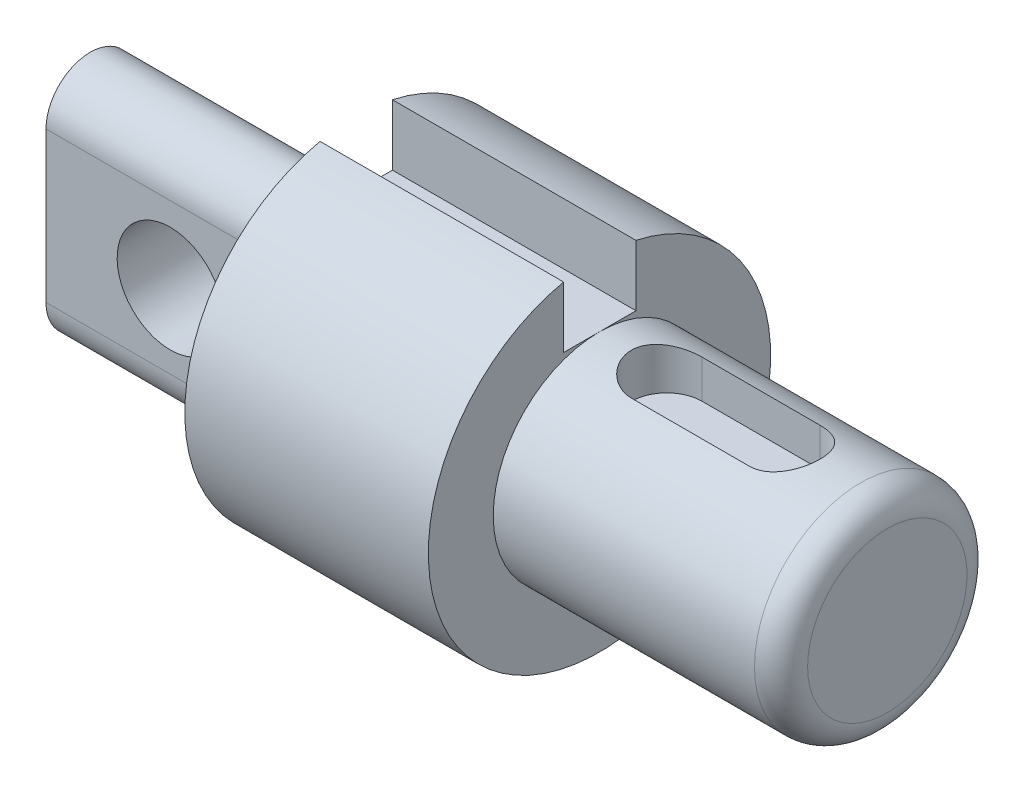
ISO-10303-21;
HEADER;
FILE_DESCRIPTION(('STEP AP214'),'2;1');
FILE_NAME('part.step','',(''),(''),'','','');
FILE_SCHEMA(('AUTOMOTIVE_DESIGN { 1 0 10303 214 1 1 1 1 }'));
ENDSEC;
DATA;
#1=APPLICATION_CONTEXT('core data for automotive mechanical design processes');
#2=APPLICATION_PROTOCOL_DEFINITION('international standard','automotive_design',2000,#1);
#3=PRODUCT_CONTEXT('',#1,'mechanical');
#4=PRODUCT('Part','Part','',(#3));
#5=PRODUCT_RELATED_PRODUCT_CATEGORY('part','',(#4));
#6=PRODUCT_DEFINITION_FORMATION('','',#4);
#7=PRODUCT_DEFINITION_CONTEXT('part definition',#1,'design');
#8=PRODUCT_DEFINITION('design','',#6,#7);
#9=PRODUCT_DEFINITION_SHAPE('','',#8);
#10=(LENGTH_UNIT() NAMED_UNIT(*) SI_UNIT(.MILLI.,.METRE.));
#11=(NAMED_UNIT(*) PLANE_ANGLE_UNIT() SI_UNIT($,.RADIAN.));
#12=(NAMED_UNIT(*) SI_UNIT($,.STERADIAN.) SOLID_ANGLE_UNIT());
#13=UNCERTAINTY_MEASURE_WITH_UNIT(LENGTH_MEASURE(1.E-05),#10,'distance_accuracy_value','');
#14=(GEOMETRIC_REPRESENTATION_CONTEXT(3) GLOBAL_UNCERTAINTY_ASSIGNED_CONTEXT((#13)) GLOBAL_UNIT_ASSIGNED_CONTEXT((#10,
#11,#12)) REPRESENTATION_CONTEXT('',''));
#15=CARTESIAN_POINT('',(0.,0.,0.));
#16=DIRECTION('',(0.,0.,1.));
#17=DIRECTION('',(1.,0.,0.));
#18=AXIS2_PLACEMENT_3D('',#15,#16,#17);
#19=CARTESIAN_POINT('',(0.,0.,0.));
#20=DIRECTION('',(1.,0.,0.));
#21=DIRECTION('',(0.,0.,-1.));
#22=AXIS2_PLACEMENT_3D('',#19,#20,#21);
#23=PLANE('',#22);
#24=DIRECTION('',(0.,-1.,0.));
#25=VECTOR('',#24,1.);
#26=CARTESIAN_POINT('',(0.,20.,-8.23672396529988));
#27=LINE('',#26,#25);
#28=CARTESIAN_POINT('',(0.,13.7691595830885,-8.23672396529988));
#29=VERTEX_POINT('',#28);
#30=CARTESIAN_POINT('',(0.,0.,-8.23672396529988));
#31=VERTEX_POINT('',#30);
#32=EDGE_CURVE('E195',#29,#31,#27,.T.);
#33=ORIENTED_EDGE('',*,*,#32,.F.);
#34=CARTESIAN_POINT('',(0.,-24.,0.));
#35=DIRECTION('',(-1.,0.,0.));
#36=DIRECTION('',(0.,0.,1.));
#37=AXIS2_PLACEMENT_3D('',#34,#35,#36);
#38=CIRCLE('',#37,38.6568627450981);
#39=CARTESIAN_POINT('',(0.,13.797214147911,8.10701177686995));
#40=VERTEX_POINT('',#39);
#41=EDGE_CURVE('E248',#29,#40,#38,.T.);
#42=ORIENTED_EDGE('',*,*,#41,.T.);
#43=DIRECTION('',(0.,-1.,0.));
#44=VECTOR('',#43,1.);
#45=CARTESIAN_POINT('',(0.,20.,8.10701177686995));
#46=LINE('',#45,#44);
#47=CARTESIAN_POINT('',(0.,0.,8.10701177686995));
#48=VERTEX_POINT('',#47);
#49=EDGE_CURVE('E191',#40,#48,#46,.T.);
#50=ORIENTED_EDGE('',*,*,#49,.T.);
#51=DIRECTION('',(0.,0.,1.));
#52=VECTOR('',#51,1.);
#53=CARTESIAN_POINT('',(0.,0.,-8.23672396529988));
#54=LINE('',#53,#52);
#55=EDGE_CURVE('E181',#31,#48,#54,.T.);
#56=ORIENTED_EDGE('',*,*,#55,.F.);
#57=EDGE_LOOP('',(#33,#42,#50,#56));
#58=FACE_BOUND('',#57,.T.);
#59=CARTESIAN_POINT('',(0.,-12.8221056297422,0.));
#60=DIRECTION('',(-1.,0.,0.));
#61=DIRECTION('',(0.,0.,1.));
#62=AXIS2_PLACEMENT_3D('',#59,#60,#61);
#63=CIRCLE('',#62,10.);
#64=CARTESIAN_POINT('',(0.,-12.8221056297422,10.));
#65=VERTEX_POINT('',#64);
#66=CARTESIAN_POINT('',(0.,-12.8221056297422,-10.));
#67=VERTEX_POINT('',#66);
#68=EDGE_CURVE('E157',#65,#67,#63,.T.);
#69=ORIENTED_EDGE('',*,*,#68,.F.);
#70=DIRECTION('',(0.,1.,0.));
#71=VECTOR('',#70,1.);
#72=CARTESIAN_POINT('',(0.,-12.8221056297422,10.));
#73=LINE('',#72,#71);
#74=CARTESIAN_POINT('',(0.,-46.7570533745629,10.));
#75=VERTEX_POINT('',#74);
#76=EDGE_CURVE('E154',#75,#65,#73,.T.);
#77=ORIENTED_EDGE('',*,*,#76,.F.);
#78=CARTESIAN_POINT('',(0.,-46.7570533745629,0.));
#79=DIRECTION('',(-1.,0.,0.));
#80=DIRECTION('',(0.,0.,1.));
#81=AXIS2_PLACEMENT_3D('',#78,#79,#80);
#82=CIRCLE('',#81,10.);
#83=CARTESIAN_POINT('',(0.,-46.7570533745629,-10.));
#84=VERTEX_POINT('',#83);
#85=EDGE_CURVE('E63',#84,#75,#82,.T.);
#86=ORIENTED_EDGE('',*,*,#85,.F.);
#87=DIRECTION('',(0.,-1.,0.));
#88=VECTOR('',#87,1.);
#89=CARTESIAN_POINT('',(0.,-12.8221056297422,-10.));
#90=LINE('',#89,#88);
#91=EDGE_CURVE('E58',#67,#84,#90,.T.);
#92=ORIENTED_EDGE('',*,*,#91,.F.);
#93=EDGE_LOOP('',(#69,#77,#86,#92));
#94=FACE_BOUND('',#93,.T.);
#95=ADVANCED_FACE('F41',(#58,#94),#23,.F.);
#96=CARTESIAN_POINT('',(-5.28155019301109,-24.,0.));
#97=DIRECTION('',(-1.,0.,0.));
#98=DIRECTION('',(0.,0.,1.));
#99=AXIS2_PLACEMENT_3D('',#96,#97,#98);
#100=CYLINDRICAL_SURFACE('',#99,38.6568627450981);
#101=DIRECTION('',(-1.,0.,0.));
#102=VECTOR('',#101,1.);
#103=CARTESIAN_POINT('',(-5.28155019301109,13.7691595830885,-8.23672396529988));
#104=LINE('',#103,#102);
#105=CARTESIAN_POINT('',(55.,13.7691595830885,-8.23672396529988));
#106=VERTEX_POINT('',#105);
#107=EDGE_CURVE('E205',#106,#29,#104,.T.);
#108=ORIENTED_EDGE('',*,*,#107,.F.);
#109=CARTESIAN_POINT('',(55.,-24.,0.));
#110=DIRECTION('',(-1.,0.,0.));
#111=DIRECTION('',(0.,0.,1.));
#112=AXIS2_PLACEMENT_3D('',#109,#110,#111);
#113=CIRCLE('',#112,38.6568627450981);
#114=CARTESIAN_POINT('',(55.,13.797214147911,8.10701177686995));
#115=VERTEX_POINT('',#114);
#116=EDGE_CURVE('E244',#106,#115,#113,.T.);
#117=ORIENTED_EDGE('',*,*,#116,.T.);
#118=DIRECTION('',(-1.,0.,0.));
#119=VECTOR('',#118,1.);
#120=CARTESIAN_POINT('',(-5.28155019301109,13.797214147911,8.10701177686995));
#121=LINE('',#120,#119);
#122=EDGE_CURVE('E202',#40,#115,#121,.F.);
#123=ORIENTED_EDGE('',*,*,#122,.F.);
#124=ORIENTED_EDGE('',*,*,#41,.F.);
#125=EDGE_LOOP('',(#108,#117,#123,#124));
#126=FACE_BOUND('',#125,.T.);
#127=ADVANCED_FACE('F308',(#126),#100,.T.);
#128=CARTESIAN_POINT('',(55.,14.656862745098,0.));
#129=DIRECTION('',(-1.,0.,0.));
#130=DIRECTION('',(0.,0.,1.));
#131=AXIS2_PLACEMENT_3D('',#128,#129,#130);
#132=PLANE('',#131);
#133=DIRECTION('',(0.,-1.,0.));
#134=VECTOR('',#133,1.);
#135=CARTESIAN_POINT('',(55.,20.,-8.23672396529988));
#136=LINE('',#135,#134);
#137=CARTESIAN_POINT('',(55.,0.,-8.23672396529988));
#138=VERTEX_POINT('',#137);
#139=EDGE_CURVE('E198',#106,#138,#136,.T.);
#140=ORIENTED_EDGE('',*,*,#139,.T.);
#141=DIRECTION('',(0.,0.,-1.));
#142=VECTOR('',#141,1.);
#143=CARTESIAN_POINT('',(55.,0.,-8.23672396529988));
#144=LINE('',#143,#142);
#145=CARTESIAN_POINT('',(55.,0.,0.));
#146=VERTEX_POINT('',#145);
#147=EDGE_CURVE('E172',#146,#138,#144,.T.);
#148=ORIENTED_EDGE('',*,*,#147,.F.);
#149=CARTESIAN_POINT('',(55.,-24.,0.));
#150=DIRECTION('',(-1.,0.,0.));
#151=DIRECTION('',(0.,0.,1.));
#152=AXIS2_PLACEMENT_3D('',#149,#150,#151);
#153=CIRCLE('',#152,24.);
#154=EDGE_CURVE('E229',#146,#146,#153,.T.);
#155=ORIENTED_EDGE('',*,*,#154,.T.);
#156=CARTESIAN_POINT('',(55.,0.,8.10701177686995));
#157=VERTEX_POINT('',#156);
#158=EDGE_CURVE('E174',#157,#146,#144,.T.);
#159=ORIENTED_EDGE('',*,*,#158,.F.);
#160=DIRECTION('',(0.,-1.,0.));
#161=VECTOR('',#160,1.);
#162=CARTESIAN_POINT('',(55.,20.,8.10701177686995));
#163=LINE('',#162,#161);
#164=EDGE_CURVE('E188',#115,#157,#163,.T.);
#165=ORIENTED_EDGE('',*,*,#164,.F.);
#166=ORIENTED_EDGE('',*,*,#116,.F.);
#167=EDGE_LOOP('',(#140,#148,#155,#159,#165,#166));
#168=FACE_BOUND('',#167,.T.);
#169=ADVANCED_FACE('F305',(#168),#132,.F.);
#170=CARTESIAN_POINT('',(-5.28155019301109,-24.,0.));
#171=DIRECTION('',(-1.,0.,0.));
#172=DIRECTION('',(0.,0.,1.));
#173=AXIS2_PLACEMENT_3D('',#170,#171,#172);
#174=CYLINDRICAL_SURFACE('',#173,24.);
#175=DIRECTION('',(-1.,0.,0.));
#176=VECTOR('',#175,1.);
#177=CARTESIAN_POINT('',(-5.28155019301109,-1.37258300203048,-8.));
#178=LINE('',#177,#176);
#179=CARTESIAN_POINT('',(70.1953780105919,-1.37258300203048,-8.));
#180=VERTEX_POINT('',#179);
#181=CARTESIAN_POINT('',(96.8123190764119,-1.37258300203048,-8.));
#182=VERTEX_POINT('',#181);
#183=EDGE_CURVE('E12',#180,#182,#178,.F.);
#184=ORIENTED_EDGE('',*,*,#183,.T.);
#185=CARTESIAN_POINT('',(96.8123190764119,-1.37258300203048,-8.));
#186=CARTESIAN_POINT('',(97.0305777607212,-1.37261881578731,-8.00003103397253));
#187=CARTESIAN_POINT('',(97.2488229333098,-1.36942629619781,-7.99106952215391));
#188=CARTESIAN_POINT('',(97.6836203807388,-1.35684672996035,-7.95539233420544));
#189=CARTESIAN_POINT('',(97.9001730966033,-1.3474613554851,-7.92868145068424));
#190=CARTESIAN_POINT('',(98.3294046882104,-1.32279442706748,-7.85784095608015));
#191=CARTESIAN_POINT('',(98.5420931140998,-1.30753036427985,-7.81376300920578));
#192=CARTESIAN_POINT('',(98.9627593468509,-1.27159268339852,-7.70860591189356));
#193=CARTESIAN_POINT('',(99.1707369831725,-1.25091886979989,-7.64752614701583));
#194=CARTESIAN_POINT('',(99.5804104924183,-1.20480489446374,-7.50895438725382));
#195=CARTESIAN_POINT('',(99.7821112878351,-1.17936858339518,-7.43147564503965));
#196=CARTESIAN_POINT('',(100.178200586441,-1.12445256650077,-7.26067322784619));
#197=CARTESIAN_POINT('',(100.372586337229,-1.09497135772433,-7.16734366014251));
#198=CARTESIAN_POINT('',(100.752836419907,-1.03279554124284,-6.96553397756357));
#199=CARTESIAN_POINT('',(100.938698978516,-1.00010026924828,-6.85705072873411));
#200=CARTESIAN_POINT('',(101.300852342869,-0.932376149650128,-6.6256519345341));
#201=CARTESIAN_POINT('',(101.477139673777,-0.897346465026512,-6.5027312003253));
#202=CARTESIAN_POINT('',(101.825095438673,-0.824625831930112,-6.23870411433486));
#203=CARTESIAN_POINT('',(101.99638376719,-0.786884620647681,-6.09711044069147));
#204=CARTESIAN_POINT('',(102.326539537596,-0.710929353356675,-5.80022937993206));
#205=CARTESIAN_POINT('',(102.485406738256,-0.672715288181531,-5.64494172699103));
#206=CARTESIAN_POINT('',(102.789797887577,-0.596826772139631,-5.32156641685159));
#207=CARTESIAN_POINT('',(102.935317132398,-0.559152515418647,-5.1534742852408));
#208=CARTESIAN_POINT('',(103.211964572097,-0.48537281416024,-4.80561194209852));
#209=CARTESIAN_POINT('',(103.343097764728,-0.44926682745154,-4.62584582091428));
#210=CARTESIAN_POINT('',(103.593417852379,-0.378643210011232,-4.25074998322404));
#211=CARTESIAN_POINT('',(103.712195054716,-0.344193216601044,-4.05513374464128));
#212=CARTESIAN_POINT('',(103.932733905434,-0.278928938556047,-3.65404556877216));
#213=CARTESIAN_POINT('',(104.0345018412,-0.248113311742212,-3.4485773095362));
#214=CARTESIAN_POINT('',(104.220214522842,-0.190986901233554,-3.02913922771072));
#215=CARTESIAN_POINT('',(104.304160127472,-0.164675900499144,-2.81516981533178));
#216=CARTESIAN_POINT('',(104.45346659983,-0.117325994006524,-2.38027596007901));
#217=CARTESIAN_POINT('',(104.518828264755,-0.096286862105315,-2.15935181599432));
#218=CARTESIAN_POINT('',(104.628394005751,-0.0607344027219715,-1.72000977307215));
#219=CARTESIAN_POINT('',(104.673254747699,-0.0460195974635165,-1.50177184659341));
#220=CARTESIAN_POINT('',(104.744642817813,-0.0224976080606529,-1.06200605406946));
#221=CARTESIAN_POINT('',(104.771170877872,-0.0136901880768622,-0.840478319723552));
#222=CARTESIAN_POINT('',(104.805628733257,-0.00223479533666958,-0.3958650024246));
#223=CARTESIAN_POINT('',(104.813562113642,0.000414364733208943,-0.172779728085906));
#224=CARTESIAN_POINT('',(104.810760540356,-0.000519530086272467,0.273257900019459));
#225=CARTESIAN_POINT('',(104.800026018792,-0.00410244072124655,0.496210256743293));
#226=CARTESIAN_POINT('',(104.760789872563,-0.0171339250305854,0.931485791446531));
#227=CARTESIAN_POINT('',(104.733006032904,-0.0263454671676339,1.14388124688078));
#228=CARTESIAN_POINT('',(104.660558975644,-0.0501837259138915,1.56553673919601));
#229=CARTESIAN_POINT('',(104.6158901541,-0.0648122403247453,1.77479571111391));
#230=CARTESIAN_POINT('',(104.510084870628,-0.0990984041516084,2.18860626056278));
#231=CARTESIAN_POINT('',(104.448953921881,-0.118754369759201,2.39315938923603));
#232=CARTESIAN_POINT('',(104.310702974943,-0.162603650576833,2.79636926246664));
#233=CARTESIAN_POINT('',(104.233576942924,-0.186798677728642,2.99502374945562));
#234=CARTESIAN_POINT('',(104.062871111967,-0.23944800385913,3.3876090612048));
#235=CARTESIAN_POINT('',(103.969093806652,-0.267952740377088,3.5814471906438));
#236=CARTESIAN_POINT('',(103.766442659186,-0.328276827276427,3.96060483828415));
#237=CARTESIAN_POINT('',(103.657563650696,-0.360097311054234,4.14592141222385));
#238=CARTESIAN_POINT('',(103.425483901893,-0.426252294036487,4.5068941081118));
#239=CARTESIAN_POINT('',(103.302282445429,-0.460586918921128,4.68254974634683));
#240=CARTESIAN_POINT('',(103.042355842802,-0.530920194718845,5.0232009487584));
#241=CARTESIAN_POINT('',(102.905630204912,-0.566918906111174,5.18819612496974));
#242=CARTESIAN_POINT('',(102.612724370301,-0.641410381347949,5.51412191940469));
#243=CARTESIAN_POINT('',(102.455930462506,-0.679940656982167,5.67449293138835));
#244=CARTESIAN_POINT('',(102.129464753586,-0.756788459235006,5.98148427361757));
#245=CARTESIAN_POINT('',(101.959797001792,-0.79510604871563,6.12810889546834));
#246=CARTESIAN_POINT('',(101.608456113104,-0.870506305498516,6.40682315490534));
#247=CARTESIAN_POINT('',(101.426774713121,-0.907588095879266,6.53890261822665));
#248=CARTESIAN_POINT('',(101.052699268743,-0.979418967728075,6.78745781697397));
#249=CARTESIAN_POINT('',(100.860309443295,-1.01416895615286,6.9039396368759));
#250=CARTESIAN_POINT('',(100.462944395078,-1.08083485549966,7.12215490772791));
#251=CARTESIAN_POINT('',(100.257821996823,-1.11269947050743,7.22363638171334));
#252=CARTESIAN_POINT('',(99.8391754109003,-1.17197012142812,7.40881268488483));
#253=CARTESIAN_POINT('',(99.6256547643362,-1.19937801200437,7.49251491735661));
#254=CARTESIAN_POINT('',(99.1918885725287,-1.24882439275111,7.64134565492558));
#255=CARTESIAN_POINT('',(98.9716506350404,-1.27086872067477,7.70649436714361));
#256=CARTESIAN_POINT('',(98.5259817831327,-1.30887055136156,7.81767760530816));
#257=CARTESIAN_POINT('',(98.3005532897417,-1.3248308332707,7.86372085933584));
#258=CARTESIAN_POINT('',(97.8650344316322,-1.3490612888241,7.9332390638637));
#259=CARTESIAN_POINT('',(97.6552201613353,-1.3578589175953,7.95826740531895));
#260=CARTESIAN_POINT('',(97.234382287092,-1.36963137121228,7.99164999637447));
#261=CARTESIAN_POINT('',(97.0233605973959,-1.3726137095866,8.0000257618744));
#262=CARTESIAN_POINT('',(96.8123190764119,-1.37258300203048,8.));
#263=B_SPLINE_CURVE_WITH_KNOTS('',3,(#185,#186,#187,#188,#189,#190,#191,#192,#193,#194,#195,
#196,#197,#198,#199,#200,#201,#202,#203,#204,#205,#206,#207,#208,#209,#210,#211,#212,#213,#214,
#215,#216,#217,#218,#219,#220,#221,#222,#223,#224,#225,#226,#227,#228,#229,#230,#231,#232,#233,
#234,#235,#236,#237,#238,#239,#240,#241,#242,#243,#244,#245,#246,#247,#248,#249,#250,#251,#252,
#253,#254,#255,#256,#257,#258,#259,#260,#261,#262),.UNSPECIFIED.,.F.,.F.,(4,2,2,2,2,2,2,2,2,2,2,
2,2,2,2,2,2,2,2,2,2,2,2,2,2,2,2,2,2,2,2,2,2,2,2,2,2,2,4),(0.,0.654547877903713,1.30891908939586,
1.96135817421321,2.61382084101742,3.26575822622461,3.91793850921429,4.57025387077327,
5.22280439628558,5.89828993537733,6.57378858975784,7.24952438368529,7.92502467674353,
8.61846244485442,9.31164331772814,10.0047907827111,10.6979085092282,11.3669250433694,
12.0359148669049,12.7047756983962,13.3736210479026,14.0160744611638,14.6587412852438,
15.3011931467132,15.9438878027294,16.5947882912859,17.2459120065947,17.8970682933825,
18.5482482643089,19.2301697730881,19.9118776729194,20.594059435017,21.2759743051343,
21.9682874467887,22.6603117412837,23.351579426262,24.0425309659451,24.6762531936181,
25.3091560893225),.UNSPECIFIED.);
#264=CARTESIAN_POINT('',(96.8123190764119,-1.37258300203048,8.));
#265=VERTEX_POINT('',#264);
#266=EDGE_CURVE('E260',#182,#265,#263,.T.);
#267=ORIENTED_EDGE('',*,*,#266,.T.);
#268=DIRECTION('',(-1.,0.,0.));
#269=VECTOR('',#268,1.);
#270=CARTESIAN_POINT('',(-5.28155019301109,-1.37258300203048,8.));
#271=LINE('',#270,#269);
#272=CARTESIAN_POINT('',(70.1953780105919,-1.37258300203048,8.));
#273=VERTEX_POINT('',#272);
#274=EDGE_CURVE('E51',#265,#273,#271,.T.);
#275=ORIENTED_EDGE('',*,*,#274,.T.);
#276=CARTESIAN_POINT('',(70.1953780105919,-1.37258300203048,8.));
#277=CARTESIAN_POINT('',(69.9771193262825,-1.37261881578731,8.00003103397253));
#278=CARTESIAN_POINT('',(69.7588741536939,-1.36942629619781,7.99106952215391));
#279=CARTESIAN_POINT('',(69.3240767062649,-1.35684672996035,7.95539233420544));
#280=CARTESIAN_POINT('',(69.1075239904004,-1.3474613554851,7.92868145068424));
#281=CARTESIAN_POINT('',(68.6782923987933,-1.32279442706748,7.85784095608015));
#282=CARTESIAN_POINT('',(68.465603972904,-1.30753036427986,7.81376300920578));
#283=CARTESIAN_POINT('',(68.0449377401528,-1.27159268339852,7.70860591189356));
#284=CARTESIAN_POINT('',(67.8369601038312,-1.25091886979989,7.64752614701583));
#285=CARTESIAN_POINT('',(67.4272865945855,-1.20480489446374,7.50895438725382));
#286=CARTESIAN_POINT('',(67.2255857991686,-1.17936858339518,7.43147564503965));
#287=CARTESIAN_POINT('',(66.8294965005629,-1.12445256650077,7.26067322784619));
#288=CARTESIAN_POINT('',(66.6351107497752,-1.09497135772433,7.16734366014251));
#289=CARTESIAN_POINT('',(66.2548606670967,-1.03279554124284,6.96553397756357));
#290=CARTESIAN_POINT('',(66.0689981084877,-1.00010026924828,6.85705072873411));
#291=CARTESIAN_POINT('',(65.7068447441351,-0.932376149650128,6.6256519345341));
#292=CARTESIAN_POINT('',(65.5305574132266,-0.897346465026512,6.5027312003253));
#293=CARTESIAN_POINT('',(65.1826016483304,-0.824625831930111,6.23870411433485));
#294=CARTESIAN_POINT('',(65.0113133198137,-0.786884620647679,6.09711044069146));
#295=CARTESIAN_POINT('',(64.6811575494077,-0.710929353356673,5.80022937993206));
#296=CARTESIAN_POINT('',(64.5222903487481,-0.672715288181531,5.64494172699104));
#297=CARTESIAN_POINT('',(64.2178991994263,-0.596826772139634,5.3215664168516));
#298=CARTESIAN_POINT('',(64.0723799546054,-0.559152515418653,5.1534742852408));
#299=CARTESIAN_POINT('',(63.7957325149071,-0.485372814160245,4.80561194209852));
#300=CARTESIAN_POINT('',(63.6645993222758,-0.449266827451542,4.62584582091428));
#301=CARTESIAN_POINT('',(63.4142792346243,-0.378643210011231,4.25074998322404));
#302=CARTESIAN_POINT('',(63.2955020322875,-0.344193216601042,4.05513374464128));
#303=CARTESIAN_POINT('',(63.0749631815702,-0.278928938556046,3.65404556877216));
#304=CARTESIAN_POINT('',(62.9731952458042,-0.248113311742214,3.4485773095362));
#305=CARTESIAN_POINT('',(62.7874825641616,-0.190986901233557,3.02913922771072));
#306=CARTESIAN_POINT('',(62.7035369595318,-0.164675900499145,2.81516981533179));
#307=CARTESIAN_POINT('',(62.5542304871733,-0.117325994006522,2.38027596007902));
#308=CARTESIAN_POINT('',(62.4888688222484,-0.0962868621053122,2.15935181599433));
#309=CARTESIAN_POINT('',(62.3793030812531,-0.0607344027219686,1.72000977307215));
#310=CARTESIAN_POINT('',(62.3344423393046,-0.0460195974635144,1.50177184659342));
#311=CARTESIAN_POINT('',(62.2630542691906,-0.0224976080606527,1.06200605406947));
#312=CARTESIAN_POINT('',(62.2365262091317,-0.013690188076863,0.840478319723557));
#313=CARTESIAN_POINT('',(62.2020683537471,-0.0022347953366712,0.395865002424603));
#314=CARTESIAN_POINT('',(62.1941349733617,0.00041436473320763,0.172779728085908));
#315=CARTESIAN_POINT('',(62.196936546648,-0.000519530086272767,-0.27325790001946));
#316=CARTESIAN_POINT('',(62.2076710682118,-0.00410244072124614,-0.496210256743294));
#317=CARTESIAN_POINT('',(62.2469072144404,-0.0171339250305843,-0.931485791446532));
#318=CARTESIAN_POINT('',(62.2746910540994,-0.0263454671676329,-1.14388124688078));
#319=CARTESIAN_POINT('',(62.3471381113596,-0.0501837259138905,-1.56553673919602));
#320=CARTESIAN_POINT('',(62.3918069329036,-0.0648122403247443,-1.77479571111392));
#321=CARTESIAN_POINT('',(62.4976122163759,-0.0990984041516083,-2.18860626056279));
#322=CARTESIAN_POINT('',(62.5587431651228,-0.118754369759202,-2.39315938923604));
#323=CARTESIAN_POINT('',(62.6969941120603,-0.162603650576833,-2.79636926246664));
#324=CARTESIAN_POINT('',(62.7741201440801,-0.186798677728639,-2.99502374945562));
#325=CARTESIAN_POINT('',(62.9448259750371,-0.239448003859131,-3.38760906120479));
#326=CARTESIAN_POINT('',(63.0386032803518,-0.267952740377094,-3.5814471906438));
#327=CARTESIAN_POINT('',(63.2412544278181,-0.328276827276433,-3.96060483828415));
#328=CARTESIAN_POINT('',(63.3501334363073,-0.360097311054234,-4.14592141222385));
#329=CARTESIAN_POINT('',(63.5822131851103,-0.426252294036484,-4.5068941081118));
#330=CARTESIAN_POINT('',(63.7054146415747,-0.460586918921125,-4.68254974634682));
#331=CARTESIAN_POINT('',(63.9653412442021,-0.530920194718846,-5.0232009487584));
#332=CARTESIAN_POINT('',(64.1020668820917,-0.566918906111178,-5.18819612496974));
#333=CARTESIAN_POINT('',(64.3949727167023,-0.641410381347951,-5.51412191940469));
#334=CARTESIAN_POINT('',(64.5517666244981,-0.679940656982167,-5.67449293138835));
#335=CARTESIAN_POINT('',(64.8782323334173,-0.756788459235003,-5.98148427361757));
#336=CARTESIAN_POINT('',(65.0479000852115,-0.795106048715629,-6.12810889546834));
#337=CARTESIAN_POINT('',(65.3992409738999,-0.870506305498518,-6.40682315490534));
#338=CARTESIAN_POINT('',(65.5809223738824,-0.907588095879269,-6.53890261822665));
#339=CARTESIAN_POINT('',(65.9549978182611,-0.979418967728077,-6.78745781697397));
#340=CARTESIAN_POINT('',(66.1473876437091,-1.01416895615286,-6.9039396368759));
#341=CARTESIAN_POINT('',(66.5447526919256,-1.08083485549965,-7.1221549077279));
#342=CARTESIAN_POINT('',(66.7498750901804,-1.11269947050743,-7.22363638171334));
#343=CARTESIAN_POINT('',(67.1685216761034,-1.17197012142812,-7.40881268488483));
#344=CARTESIAN_POINT('',(67.3820423226675,-1.19937801200437,-7.49251491735661));
#345=CARTESIAN_POINT('',(67.8158085144751,-1.24882439275111,-7.64134565492558));
#346=CARTESIAN_POINT('',(68.0360464519633,-1.27086872067477,-7.70649436714361));
#347=CARTESIAN_POINT('',(68.481715303871,-1.30887055136156,-7.81767760530816));
#348=CARTESIAN_POINT('',(68.707143797262,-1.3248308332707,-7.86372085933583));
#349=CARTESIAN_POINT('',(69.1426626553715,-1.34906128882411,-7.9332390638637));
#350=CARTESIAN_POINT('',(69.3524769256684,-1.3578589175953,-7.95826740531895));
#351=CARTESIAN_POINT('',(69.7733147999117,-1.36963137121228,-7.99164999637447));
#352=CARTESIAN_POINT('',(69.9843364896078,-1.37261370958659,-8.0000257618744));
#353=CARTESIAN_POINT('',(70.1953780105919,-1.37258300203048,-8.));
#354=B_SPLINE_CURVE_WITH_KNOTS('',3,(#276,#277,#278,#279,#280,#281,#282,#283,#284,#285,#286,
#287,#288,#289,#290,#291,#292,#293,#294,#295,#296,#297,#298,#299,#300,#301,#302,#303,#304,#305,
#306,#307,#308,#309,#310,#311,#312,#313,#314,#315,#316,#317,#318,#319,#320,#321,#322,#323,#324,
#325,#326,#327,#328,#329,#330,#331,#332,#333,#334,#335,#336,#337,#338,#339,#340,#341,#342,#343,
#344,#345,#346,#347,#348,#349,#350,#351,#352,#353),.UNSPECIFIED.,.F.,.F.,(4,2,2,2,2,2,2,2,2,2,2,
2,2,2,2,2,2,2,2,2,2,2,2,2,2,2,2,2,2,2,2,2,2,2,2,2,2,2,4),(0.,0.654547877903713,1.30891908939586,
1.96135817421321,2.61382084101742,3.26575822622461,3.91793850921429,4.57025387077327,
5.22280439628558,5.89828993537733,6.57378858975783,7.24952438368529,7.92502467674353,
8.61846244485442,9.31164331772813,10.0047907827111,10.6979085092282,11.3669250433694,
12.0359148669049,12.7047756983962,13.3736210479026,14.0160744611638,14.6587412852439,
15.3011931467132,15.9438878027294,16.5947882912859,17.2459120065947,17.8970682933825,
18.5482482643089,19.2301697730881,19.9118776729194,20.5940594350171,21.2759743051343,
21.9682874467887,22.6603117412837,23.351579426262,24.0425309659451,24.6762531936181,
25.3091560893225),.UNSPECIFIED.);
#355=EDGE_CURVE('E270',#273,#180,#354,.T.);
#356=ORIENTED_EDGE('',*,*,#355,.T.);
#357=EDGE_LOOP('',(#184,#267,#275,#356));
#358=FACE_BOUND('',#357,.T.);
#359=CARTESIAN_POINT('',(114.,-24.,0.));
#360=DIRECTION('',(-1.,0.,0.));
#361=DIRECTION('',(0.,0.,1.));
#362=AXIS2_PLACEMENT_3D('',#359,#360,#361);
#363=CIRCLE('',#362,24.);
#364=CARTESIAN_POINT('',(114.,-24.,24.));
#365=VERTEX_POINT('',#364);
#366=EDGE_CURVE('E252',#365,#365,#363,.T.);
#367=ORIENTED_EDGE('',*,*,#366,.T.);
#368=EDGE_LOOP('',(#367));
#369=FACE_BOUND('',#368,.T.);
#370=ORIENTED_EDGE('',*,*,#154,.F.);
#371=EDGE_LOOP('',(#370));
#372=FACE_BOUND('',#371,.T.);
#373=ADVANCED_FACE('F277',(#358,#369,#372),#174,.T.);
#374=CARTESIAN_POINT('',(120.,0.,0.));
#375=DIRECTION('',(-1.,0.,0.));
#376=DIRECTION('',(0.,0.,1.));
#377=AXIS2_PLACEMENT_3D('',#374,#375,#376);
#378=PLANE('',#377);
#379=CARTESIAN_POINT('',(120.,-24.,0.));
#380=DIRECTION('',(-1.,0.,0.));
#381=DIRECTION('',(0.,0.,1.));
#382=AXIS2_PLACEMENT_3D('',#379,#380,#381);
#383=CIRCLE('',#382,18.);
#384=CARTESIAN_POINT('',(120.,-24.,18.));
#385=VERTEX_POINT('',#384);
#386=EDGE_CURVE('E256',#385,#385,#383,.F.);
#387=ORIENTED_EDGE('',*,*,#386,.T.);
#388=EDGE_LOOP('',(#387));
#389=FACE_BOUND('',#388,.T.);
#390=ADVANCED_FACE('F297',(#389),#378,.F.);
#391=CARTESIAN_POINT('',(114.,-24.,0.));
#392=DIRECTION('',(-1.,0.,0.));
#393=DIRECTION('',(0.,0.,1.));
#394=AXIS2_PLACEMENT_3D('',#391,#392,#393);
#395=TOROIDAL_SURFACE('',#394,18.,6.);
#396=ORIENTED_EDGE('',*,*,#386,.F.);
#397=EDGE_LOOP('',(#396));
#398=FACE_BOUND('',#397,.T.);
#399=ORIENTED_EDGE('',*,*,#366,.F.);
#400=EDGE_LOOP('',(#399));
#401=FACE_BOUND('',#400,.T.);
#402=ADVANCED_FACE('F43',(#398,#401),#395,.T.);
#403=CARTESIAN_POINT('',(70.1953780105919,-10.,0.));
#404=DIRECTION('',(0.,1.,0.));
#405=DIRECTION('',(0.,0.,1.));
#406=AXIS2_PLACEMENT_3D('',#403,#404,#405);
#407=CYLINDRICAL_SURFACE('',#406,8.);
#408=DIRECTION('',(0.,1.,0.));
#409=VECTOR('',#408,1.);
#410=CARTESIAN_POINT('',(70.1953780105919,-10.,8.));
#411=LINE('',#410,#409);
#412=CARTESIAN_POINT('',(70.1953780105919,-10.,8.));
#413=VERTEX_POINT('',#412);
#414=EDGE_CURVE('E224',#413,#273,#411,.T.);
#415=ORIENTED_EDGE('',*,*,#414,.F.);
#416=CARTESIAN_POINT('',(70.1953780105919,-10.,0.));
#417=DIRECTION('',(0.,1.,0.));
#418=DIRECTION('',(0.,0.,1.));
#419=AXIS2_PLACEMENT_3D('',#416,#417,#418);
#420=CIRCLE('',#419,8.);
#421=CARTESIAN_POINT('',(70.1953780105919,-10.,-8.));
#422=VERTEX_POINT('',#421);
#423=EDGE_CURVE('E208',#422,#413,#420,.T.);
#424=ORIENTED_EDGE('',*,*,#423,.F.);
#425=DIRECTION('',(0.,1.,0.));
#426=VECTOR('',#425,1.);
#427=CARTESIAN_POINT('',(70.1953780105919,-10.,-8.));
#428=LINE('',#427,#426);
#429=EDGE_CURVE('E225',#422,#180,#428,.T.);
#430=ORIENTED_EDGE('',*,*,#429,.T.);
#431=ORIENTED_EDGE('',*,*,#355,.F.);
#432=EDGE_LOOP('',(#415,#424,#430,#431));
#433=FACE_BOUND('',#432,.T.);
#434=ADVANCED_FACE('F293',(#433),#407,.F.);
#435=CARTESIAN_POINT('',(70.1953780105919,-10.,-8.));
#436=DIRECTION('',(0.,0.,-1.));
#437=DIRECTION('',(-1.,0.,0.));
#438=AXIS2_PLACEMENT_3D('',#435,#436,#437);
#439=PLANE('',#438);
#440=ORIENTED_EDGE('',*,*,#429,.F.);
#441=DIRECTION('',(-1.,0.,0.));
#442=VECTOR('',#441,1.);
#443=CARTESIAN_POINT('',(70.1953780105919,-10.,-8.));
#444=LINE('',#443,#442);
#445=CARTESIAN_POINT('',(96.8123190764119,-10.,-8.));
#446=VERTEX_POINT('',#445);
#447=EDGE_CURVE('E220',#446,#422,#444,.T.);
#448=ORIENTED_EDGE('',*,*,#447,.F.);
#449=DIRECTION('',(0.,1.,0.));
#450=VECTOR('',#449,1.);
#451=CARTESIAN_POINT('',(96.8123190764119,-10.,-8.));
#452=LINE('',#451,#450);
#453=EDGE_CURVE('E230',#446,#182,#452,.T.);
#454=ORIENTED_EDGE('',*,*,#453,.T.);
#455=ORIENTED_EDGE('',*,*,#183,.F.);
#456=EDGE_LOOP('',(#440,#448,#454,#455));
#457=FACE_BOUND('',#456,.T.);
#458=ADVANCED_FACE('F287',(#457),#439,.F.);
#459=CARTESIAN_POINT('',(96.8123190764119,-10.,0.));
#460=DIRECTION('',(0.,1.,0.));
#461=DIRECTION('',(0.,0.,1.));
#462=AXIS2_PLACEMENT_3D('',#459,#460,#461);
#463=CYLINDRICAL_SURFACE('',#462,8.);
#464=ORIENTED_EDGE('',*,*,#453,.F.);
#465=CARTESIAN_POINT('',(96.8123190764119,-10.,0.));
#466=DIRECTION('',(0.,1.,0.));
#467=DIRECTION('',(0.,0.,1.));
#468=AXIS2_PLACEMENT_3D('',#465,#466,#467);
#469=CIRCLE('',#468,8.);
#470=CARTESIAN_POINT('',(96.8123190764119,-10.,8.));
#471=VERTEX_POINT('',#470);
#472=EDGE_CURVE('E216',#471,#446,#469,.T.);
#473=ORIENTED_EDGE('',*,*,#472,.F.);
#474=DIRECTION('',(0.,1.,0.));
#475=VECTOR('',#474,1.);
#476=CARTESIAN_POINT('',(96.8123190764119,-10.,8.));
#477=LINE('',#476,#475);
#478=EDGE_CURVE('E234',#471,#265,#477,.T.);
#479=ORIENTED_EDGE('',*,*,#478,.T.);
#480=ORIENTED_EDGE('',*,*,#266,.F.);
#481=EDGE_LOOP('',(#464,#473,#479,#480));
#482=FACE_BOUND('',#481,.T.);
#483=ADVANCED_FACE('F281',(#482),#463,.F.);
#484=CARTESIAN_POINT('',(70.1953780105919,-10.,8.));
#485=DIRECTION('',(0.,0.,1.));
#486=DIRECTION('',(1.,0.,0.));
#487=AXIS2_PLACEMENT_3D('',#484,#485,#486);
#488=PLANE('',#487);
#489=ORIENTED_EDGE('',*,*,#478,.F.);
#490=DIRECTION('',(1.,0.,0.));
#491=VECTOR('',#490,1.);
#492=CARTESIAN_POINT('',(70.1953780105919,-10.,8.));
#493=LINE('',#492,#491);
#494=EDGE_CURVE('E212',#413,#471,#493,.T.);
#495=ORIENTED_EDGE('',*,*,#494,.F.);
#496=ORIENTED_EDGE('',*,*,#414,.T.);
#497=ORIENTED_EDGE('',*,*,#274,.F.);
#498=EDGE_LOOP('',(#489,#495,#496,#497));
#499=FACE_BOUND('',#498,.T.);
#500=ADVANCED_FACE('F286',(#499),#488,.F.);
#501=CARTESIAN_POINT('',(70.1953780105919,-10.,0.));
#502=DIRECTION('',(0.,1.,0.));
#503=DIRECTION('',(0.,0.,1.));
#504=AXIS2_PLACEMENT_3D('',#501,#502,#503);
#505=PLANE('',#504);
#506=ORIENTED_EDGE('',*,*,#423,.T.);
#507=ORIENTED_EDGE('',*,*,#494,.T.);
#508=ORIENTED_EDGE('',*,*,#472,.T.);
#509=ORIENTED_EDGE('',*,*,#447,.T.);
#510=EDGE_LOOP('',(#506,#507,#508,#509));
#511=FACE_BOUND('',#510,.T.);
#512=ADVANCED_FACE('F291',(#511),#505,.T.);
#513=CARTESIAN_POINT('',(0.,20.,-8.23672396529988));
#514=DIRECTION('',(0.,0.,1.));
#515=DIRECTION('',(1.,0.,0.));
#516=AXIS2_PLACEMENT_3D('',#513,#514,#515);
#517=PLANE('',#516);
#518=ORIENTED_EDGE('',*,*,#107,.T.);
#519=ORIENTED_EDGE('',*,*,#32,.T.);
#520=DIRECTION('',(-1.,0.,0.));
#521=VECTOR('',#520,1.);
#522=CARTESIAN_POINT('',(0.,0.,-8.23672396529988));
#523=LINE('',#522,#521);
#524=EDGE_CURVE('E177',#138,#31,#523,.T.);
#525=ORIENTED_EDGE('',*,*,#524,.F.);
#526=ORIENTED_EDGE('',*,*,#139,.F.);
#527=EDGE_LOOP('',(#518,#519,#525,#526));
#528=FACE_BOUND('',#527,.T.);
#529=ADVANCED_FACE('F326',(#528),#517,.T.);
#530=CARTESIAN_POINT('',(0.,20.,8.10701177686995));
#531=DIRECTION('',(0.,0.,-1.));
#532=DIRECTION('',(-1.,0.,0.));
#533=AXIS2_PLACEMENT_3D('',#530,#531,#532);
#534=PLANE('',#533);
#535=ORIENTED_EDGE('',*,*,#122,.T.);
#536=ORIENTED_EDGE('',*,*,#164,.T.);
#537=DIRECTION('',(1.,0.,0.));
#538=VECTOR('',#537,1.);
#539=CARTESIAN_POINT('',(0.,0.,8.10701177686995));
#540=LINE('',#539,#538);
#541=EDGE_CURVE('E184',#48,#157,#540,.T.);
#542=ORIENTED_EDGE('',*,*,#541,.F.);
#543=ORIENTED_EDGE('',*,*,#49,.F.);
#544=EDGE_LOOP('',(#535,#536,#542,#543));
#545=FACE_BOUND('',#544,.T.);
#546=ADVANCED_FACE('F371',(#545),#534,.T.);
#547=CARTESIAN_POINT('',(0.,0.,0.));
#548=DIRECTION('',(0.,1.,0.));
#549=DIRECTION('',(0.,0.,1.));
#550=AXIS2_PLACEMENT_3D('',#547,#548,#549);
#551=PLANE('',#550);
#552=CARTESIAN_POINT('',(27.9643241090346,0.,0.));
#553=DIRECTION('',(0.,1.,0.));
#554=DIRECTION('',(0.,0.,1.));
#555=AXIS2_PLACEMENT_3D('',#552,#553,#554);
#556=CIRCLE('',#555,5.19858259340958);
#557=CARTESIAN_POINT('',(27.9643241090346,0.,5.19858259340958));
#558=VERTEX_POINT('',#557);
#559=EDGE_CURVE('E159',#558,#558,#556,.T.);
#560=ORIENTED_EDGE('',*,*,#559,.F.);
#561=EDGE_LOOP('',(#560));
#562=FACE_BOUND('',#561,.T.);
#563=ORIENTED_EDGE('',*,*,#158,.T.);
#564=ORIENTED_EDGE('',*,*,#147,.T.);
#565=ORIENTED_EDGE('',*,*,#524,.T.);
#566=ORIENTED_EDGE('',*,*,#55,.T.);
#567=ORIENTED_EDGE('',*,*,#541,.T.);
#568=EDGE_LOOP('',(#563,#564,#565,#566,#567));
#569=FACE_BOUND('',#568,.T.);
#570=ADVANCED_FACE('F331',(#562,#569),#551,.T.);
#571=CARTESIAN_POINT('',(27.9643241090346,-10.,0.));
#572=DIRECTION('',(0.,1.,0.));
#573=DIRECTION('',(0.,0.,1.));
#574=AXIS2_PLACEMENT_3D('',#571,#572,#573);
#575=CYLINDRICAL_SURFACE('',#574,5.19858259340958);
#576=CARTESIAN_POINT('',(27.9643241090346,-10.,0.));
#577=DIRECTION('',(0.,1.,0.));
#578=DIRECTION('',(0.,0.,1.));
#579=AXIS2_PLACEMENT_3D('',#576,#577,#578);
#580=CIRCLE('',#579,5.19858259340958);
#581=CARTESIAN_POINT('',(27.9643241090346,-10.,5.19858259340958));
#582=VERTEX_POINT('',#581);
#583=EDGE_CURVE('E164',#582,#582,#580,.T.);
#584=ORIENTED_EDGE('',*,*,#583,.F.);
#585=EDGE_LOOP('',(#584));
#586=FACE_BOUND('',#585,.T.);
#587=ORIENTED_EDGE('',*,*,#559,.T.);
#588=EDGE_LOOP('',(#587));
#589=FACE_BOUND('',#588,.T.);
#590=ADVANCED_FACE('F386',(#586,#589),#575,.F.);
#591=CARTESIAN_POINT('',(27.9643241090346,-10.,0.));
#592=DIRECTION('',(0.,1.,0.));
#593=DIRECTION('',(0.,0.,1.));
#594=AXIS2_PLACEMENT_3D('',#591,#592,#593);
#595=PLANE('',#594);
#596=ORIENTED_EDGE('',*,*,#583,.T.);
#597=EDGE_LOOP('',(#596));
#598=FACE_BOUND('',#597,.T.);
#599=ADVANCED_FACE('F394',(#598),#595,.T.);
#600=CARTESIAN_POINT('',(-60.,-12.8221056297422,0.));
#601=DIRECTION('',(1.,0.,0.));
#602=DIRECTION('',(0.,0.,-1.));
#603=AXIS2_PLACEMENT_3D('',#600,#601,#602);
#604=CYLINDRICAL_SURFACE('',#603,10.);
#605=ORIENTED_EDGE('',*,*,#68,.T.);
#606=DIRECTION('',(1.,0.,0.));
#607=VECTOR('',#606,1.);
#608=CARTESIAN_POINT('',(-60.,-12.8221056297422,-10.));
#609=LINE('',#608,#607);
#610=CARTESIAN_POINT('',(-60.,-12.8221056297422,-10.));
#611=VERTEX_POINT('',#610);
#612=EDGE_CURVE('E136',#611,#67,#609,.T.);
#613=ORIENTED_EDGE('',*,*,#612,.F.);
#614=CARTESIAN_POINT('',(-60.,-12.8221056297422,0.));
#615=DIRECTION('',(-1.,0.,0.));
#616=DIRECTION('',(0.,0.,1.));
#617=AXIS2_PLACEMENT_3D('',#614,#615,#616);
#618=CIRCLE('',#617,10.);
#619=CARTESIAN_POINT('',(-60.,-12.8221056297422,10.));
#620=VERTEX_POINT('',#619);
#621=EDGE_CURVE('E144',#620,#611,#618,.T.);
#622=ORIENTED_EDGE('',*,*,#621,.F.);
#623=DIRECTION('',(1.,0.,0.));
#624=VECTOR('',#623,1.);
#625=CARTESIAN_POINT('',(-60.,-12.8221056297422,10.));
#626=LINE('',#625,#624);
#627=EDGE_CURVE('E528',#620,#65,#626,.T.);
#628=ORIENTED_EDGE('',*,*,#627,.T.);
#629=EDGE_LOOP('',(#605,#613,#622,#628));
#630=FACE_BOUND('',#629,.T.);
#631=ADVANCED_FACE('F156',(#630),#604,.T.);
#632=CARTESIAN_POINT('',(-60.,-12.8221056297422,-10.));
#633=DIRECTION('',(0.,0.,1.));
#634=DIRECTION('',(0.,-1.,0.));
#635=AXIS2_PLACEMENT_3D('',#632,#633,#634);
#636=PLANE('',#635);
#637=CARTESIAN_POINT('',(-31.933586772297,-30.0141792952928,-10.));
#638=DIRECTION('',(0.,0.,-1.));
#639=DIRECTION('',(0.,1.,0.));
#640=AXIS2_PLACEMENT_3D('',#637,#638,#639);
#641=CIRCLE('',#640,12.);
#642=CARTESIAN_POINT('',(-31.933586772297,-18.0141792952928,-10.));
#643=VERTEX_POINT('',#642);
#644=EDGE_CURVE('E516',#643,#643,#641,.T.);
#645=ORIENTED_EDGE('',*,*,#644,.F.);
#646=EDGE_LOOP('',(#645));
#647=FACE_BOUND('',#646,.T.);
#648=ORIENTED_EDGE('',*,*,#91,.T.);
#649=DIRECTION('',(1.,0.,0.));
#650=VECTOR('',#649,1.);
#651=CARTESIAN_POINT('',(-60.,-46.7570533745629,-10.));
#652=LINE('',#651,#650);
#653=CARTESIAN_POINT('',(-60.,-46.7570533745629,-10.));
#654=VERTEX_POINT('',#653);
#655=EDGE_CURVE('E139',#654,#84,#652,.T.);
#656=ORIENTED_EDGE('',*,*,#655,.F.);
#657=DIRECTION('',(0.,-1.,0.));
#658=VECTOR('',#657,1.);
#659=CARTESIAN_POINT('',(-60.,-12.8221056297422,-10.));
#660=LINE('',#659,#658);
#661=EDGE_CURVE('E132',#611,#654,#660,.T.);
#662=ORIENTED_EDGE('',*,*,#661,.F.);
#663=ORIENTED_EDGE('',*,*,#612,.T.);
#664=EDGE_LOOP('',(#648,#656,#662,#663));
#665=FACE_BOUND('',#664,.T.);
#666=ADVANCED_FACE('F134',(#647,#665),#636,.F.);
#667=CARTESIAN_POINT('',(-60.,-46.7570533745629,0.));
#668=DIRECTION('',(1.,0.,0.));
#669=DIRECTION('',(0.,0.,-1.));
#670=AXIS2_PLACEMENT_3D('',#667,#668,#669);
#671=CYLINDRICAL_SURFACE('',#670,10.);
#672=ORIENTED_EDGE('',*,*,#85,.T.);
#673=DIRECTION('',(1.,0.,0.));
#674=VECTOR('',#673,1.);
#675=CARTESIAN_POINT('',(-60.,-46.7570533745629,10.));
#676=LINE('',#675,#674);
#677=CARTESIAN_POINT('',(-60.,-46.7570533745629,10.));
#678=VERTEX_POINT('',#677);
#679=EDGE_CURVE('E166',#678,#75,#676,.T.);
#680=ORIENTED_EDGE('',*,*,#679,.F.);
#681=CARTESIAN_POINT('',(-60.,-46.7570533745629,0.));
#682=DIRECTION('',(-1.,0.,0.));
#683=DIRECTION('',(0.,0.,1.));
#684=AXIS2_PLACEMENT_3D('',#681,#682,#683);
#685=CIRCLE('',#684,10.);
#686=EDGE_CURVE('E143',#654,#678,#685,.T.);
#687=ORIENTED_EDGE('',*,*,#686,.F.);
#688=ORIENTED_EDGE('',*,*,#655,.T.);
#689=EDGE_LOOP('',(#672,#680,#687,#688));
#690=FACE_BOUND('',#689,.T.);
#691=ADVANCED_FACE('F416',(#690),#671,.T.);
#692=CARTESIAN_POINT('',(-60.,-12.8221056297422,10.));
#693=DIRECTION('',(0.,0.,-1.));
#694=DIRECTION('',(-1.,0.,0.));
#695=AXIS2_PLACEMENT_3D('',#692,#693,#694);
#696=PLANE('',#695);
#697=CARTESIAN_POINT('',(-31.933586772297,-30.0141792952928,10.));
#698=DIRECTION('',(0.,0.,-1.));
#699=DIRECTION('',(-1.,0.,0.));
#700=AXIS2_PLACEMENT_3D('',#697,#698,#699);
#701=CIRCLE('',#700,12.);
#702=CARTESIAN_POINT('',(-31.933586772297,-18.0141792952928,10.));
#703=VERTEX_POINT('',#702);
#704=EDGE_CURVE('E45',#703,#703,#701,.T.);
#705=ORIENTED_EDGE('',*,*,#704,.T.);
#706=EDGE_LOOP('',(#705));
#707=FACE_BOUND('',#706,.T.);
#708=ORIENTED_EDGE('',*,*,#76,.T.);
#709=ORIENTED_EDGE('',*,*,#627,.F.);
#710=DIRECTION('',(0.,1.,0.));
#711=VECTOR('',#710,1.);
#712=CARTESIAN_POINT('',(-60.,-12.8221056297422,10.));
#713=LINE('',#712,#711);
#714=EDGE_CURVE('E149',#678,#620,#713,.T.);
#715=ORIENTED_EDGE('',*,*,#714,.F.);
#716=ORIENTED_EDGE('',*,*,#679,.T.);
#717=EDGE_LOOP('',(#708,#709,#715,#716));
#718=FACE_BOUND('',#717,.T.);
#719=ADVANCED_FACE('F425',(#707,#718),#696,.F.);
#720=CARTESIAN_POINT('',(-60.,-12.8221056297422,0.));
#721=DIRECTION('',(-1.,0.,0.));
#722=DIRECTION('',(0.,0.,1.));
#723=AXIS2_PLACEMENT_3D('',#720,#721,#722);
#724=PLANE('',#723);
#725=ORIENTED_EDGE('',*,*,#621,.T.);
#726=ORIENTED_EDGE('',*,*,#661,.T.);
#727=ORIENTED_EDGE('',*,*,#686,.T.);
#728=ORIENTED_EDGE('',*,*,#714,.T.);
#729=EDGE_LOOP('',(#725,#726,#727,#728));
#730=FACE_BOUND('',#729,.T.);
#731=ADVANCED_FACE('F147',(#730),#724,.T.);
#732=CARTESIAN_POINT('',(-31.933586772297,-30.0141792952928,50.));
#733=DIRECTION('',(0.,0.,-1.));
#734=DIRECTION('',(0.,1.,0.));
#735=AXIS2_PLACEMENT_3D('',#732,#733,#734);
#736=CYLINDRICAL_SURFACE('',#735,12.);
#737=CARTESIAN_POINT('',(-31.933586772297,-18.0141792952928,-10.));
#738=CARTESIAN_POINT('',(-31.933586772297,-18.0141792952928,-9.79166666666667));
#739=CARTESIAN_POINT('',(-31.933586772297,-18.0141792952928,-9.58333333333333));
#740=CARTESIAN_POINT('',(-31.933586772297,-18.0141792952928,-9.16666666666667));
#741=CARTESIAN_POINT('',(-31.933586772297,-18.0141792952928,-8.95833333333333));
#742=CARTESIAN_POINT('',(-31.933586772297,-18.0141792952928,-8.54166666666667));
#743=CARTESIAN_POINT('',(-31.933586772297,-18.0141792952928,-8.33333333333333));
#744=CARTESIAN_POINT('',(-31.933586772297,-18.0141792952928,-7.91666666666667));
#745=CARTESIAN_POINT('',(-31.933586772297,-18.0141792952928,-7.70833333333333));
#746=CARTESIAN_POINT('',(-31.933586772297,-18.0141792952928,-7.29166666666667));
#747=CARTESIAN_POINT('',(-31.933586772297,-18.0141792952928,-7.08333333333333));
#748=CARTESIAN_POINT('',(-31.933586772297,-18.0141792952928,-6.66666666666667));
#749=CARTESIAN_POINT('',(-31.933586772297,-18.0141792952928,-6.45833333333333));
#750=CARTESIAN_POINT('',(-31.933586772297,-18.0141792952928,-6.04166666666667));
#751=CARTESIAN_POINT('',(-31.933586772297,-18.0141792952928,-5.83333333333333));
#752=CARTESIAN_POINT('',(-31.933586772297,-18.0141792952928,-5.41666666666666));
#753=CARTESIAN_POINT('',(-31.933586772297,-18.0141792952928,-5.20833333333333));
#754=CARTESIAN_POINT('',(-31.933586772297,-18.0141792952928,-4.79166666666666));
#755=CARTESIAN_POINT('',(-31.933586772297,-18.0141792952928,-4.58333333333333));
#756=CARTESIAN_POINT('',(-31.933586772297,-18.0141792952928,-4.16666666666667));
#757=CARTESIAN_POINT('',(-31.933586772297,-18.0141792952928,-3.95833333333333));
#758=CARTESIAN_POINT('',(-31.933586772297,-18.0141792952928,-3.54166666666667));
#759=CARTESIAN_POINT('',(-31.933586772297,-18.0141792952928,-3.33333333333334));
#760=CARTESIAN_POINT('',(-31.933586772297,-18.0141792952928,-2.91666666666667));
#761=CARTESIAN_POINT('',(-31.933586772297,-18.0141792952928,-2.70833333333334));
#762=CARTESIAN_POINT('',(-31.933586772297,-18.0141792952928,-2.29166666666667));
#763=CARTESIAN_POINT('',(-31.933586772297,-18.0141792952928,-2.08333333333334));
#764=CARTESIAN_POINT('',(-31.933586772297,-18.0141792952928,-1.66666666666667));
#765=CARTESIAN_POINT('',(-31.933586772297,-18.0141792952928,-1.45833333333333));
#766=CARTESIAN_POINT('',(-31.933586772297,-18.0141792952928,-1.04166666666667));
#767=CARTESIAN_POINT('',(-31.933586772297,-18.0141792952928,-0.833333333333334));
#768=CARTESIAN_POINT('',(-31.933586772297,-18.0141792952928,-0.416666666666667));
#769=CARTESIAN_POINT('',(-31.933586772297,-18.0141792952928,-0.208333333333333));
#770=CARTESIAN_POINT('',(-31.933586772297,-18.0141792952928,0.208333333333333));
#771=CARTESIAN_POINT('',(-31.933586772297,-18.0141792952928,0.416666666666667));
#772=CARTESIAN_POINT('',(-31.933586772297,-18.0141792952928,0.833333333333334));
#773=CARTESIAN_POINT('',(-31.933586772297,-18.0141792952928,1.04166666666667));
#774=CARTESIAN_POINT('',(-31.933586772297,-18.0141792952928,1.45833333333333));
#775=CARTESIAN_POINT('',(-31.933586772297,-18.0141792952928,1.66666666666667));
#776=CARTESIAN_POINT('',(-31.933586772297,-18.0141792952928,2.08333333333334));
#777=CARTESIAN_POINT('',(-31.933586772297,-18.0141792952928,2.29166666666667));
#778=CARTESIAN_POINT('',(-31.933586772297,-18.0141792952928,2.70833333333334));
#779=CARTESIAN_POINT('',(-31.933586772297,-18.0141792952928,2.91666666666667));
#780=CARTESIAN_POINT('',(-31.933586772297,-18.0141792952928,3.33333333333333));
#781=CARTESIAN_POINT('',(-31.933586772297,-18.0141792952928,3.54166666666667));
#782=CARTESIAN_POINT('',(-31.933586772297,-18.0141792952928,3.95833333333333));
#783=CARTESIAN_POINT('',(-31.933586772297,-18.0141792952928,4.16666666666666));
#784=CARTESIAN_POINT('',(-31.933586772297,-18.0141792952928,4.58333333333333));
#785=CARTESIAN_POINT('',(-31.933586772297,-18.0141792952928,4.79166666666666));
#786=CARTESIAN_POINT('',(-31.933586772297,-18.0141792952928,5.20833333333333));
#787=CARTESIAN_POINT('',(-31.933586772297,-18.0141792952928,5.41666666666666));
#788=CARTESIAN_POINT('',(-31.933586772297,-18.0141792952928,5.83333333333333));
#789=CARTESIAN_POINT('',(-31.933586772297,-18.0141792952928,6.04166666666667));
#790=CARTESIAN_POINT('',(-31.933586772297,-18.0141792952928,6.45833333333333));
#791=CARTESIAN_POINT('',(-31.933586772297,-18.0141792952928,6.66666666666667));
#792=CARTESIAN_POINT('',(-31.933586772297,-18.0141792952928,7.08333333333333));
#793=CARTESIAN_POINT('',(-31.933586772297,-18.0141792952928,7.29166666666667));
#794=CARTESIAN_POINT('',(-31.933586772297,-18.0141792952928,7.70833333333333));
#795=CARTESIAN_POINT('',(-31.933586772297,-18.0141792952928,7.91666666666667));
#796=CARTESIAN_POINT('',(-31.933586772297,-18.0141792952928,8.33333333333333));
#797=CARTESIAN_POINT('',(-31.933586772297,-18.0141792952928,8.54166666666667));
#798=CARTESIAN_POINT('',(-31.933586772297,-18.0141792952928,8.95833333333333));
#799=CARTESIAN_POINT('',(-31.933586772297,-18.0141792952928,9.16666666666667));
#800=CARTESIAN_POINT('',(-31.933586772297,-18.0141792952928,9.58333333333333));
#801=CARTESIAN_POINT('',(-31.933586772297,-18.0141792952928,9.79166666666667));
#802=CARTESIAN_POINT('',(-31.933586772297,-18.0141792952928,10.));
#803=B_SPLINE_CURVE_WITH_KNOTS('',3,(#737,#738,#739,#740,#741,#742,#743,#744,#745,#746,#747,
#748,#749,#750,#751,#752,#753,#754,#755,#756,#757,#758,#759,#760,#761,#762,#763,#764,#765,#766,
#767,#768,#769,#770,#771,#772,#773,#774,#775,#776,#777,#778,#779,#780,#781,#782,#783,#784,#785,
#786,#787,#788,#789,#790,#791,#792,#793,#794,#795,#796,#797,#798,#799,#800,#801,#802),
.UNSPECIFIED.,.F.,.F.,(4,2,2,2,2,2,2,2,2,2,2,2,2,2,2,2,2,2,2,2,2,2,2,2,2,2,2,2,2,2,2,2,4),(0.,
0.625000000000001,1.25,1.875,2.5,3.125,3.75,4.375,5.,5.62500000000001,6.25,6.875,7.5,8.125,8.75,
9.375,10.,10.625,11.25,11.875,12.5,13.125,13.75,14.375,15.,15.625,16.25,16.875,17.5,18.125,
18.75,19.375,20.),.UNSPECIFIED.);
#804=EDGE_CURVE('BSEAM439',#643,#703,#803,.T.);
#805=ORIENTED_EDGE('',*,*,#644,.T.);
#806=ORIENTED_EDGE('',*,*,#704,.F.);
#807=ORIENTED_EDGE('',*,*,#804,.T.);
#808=ORIENTED_EDGE('',*,*,#804,.F.);
#809=EDGE_LOOP('',(#805,#807,#806,#808));
#810=FACE_BOUND('',#809,.T.);
#811=ADVANCED_FACE('F439',(#810),#736,.F.);
#812=CLOSED_SHELL('',(#95,#127,#169,#373,#390,#402,#434,#458,#483,#500,#512,#529,#546,#570,#590,
#599,#631,#666,#691,#719,#731,#811));
#813=MANIFOLD_SOLID_BREP('B2',#812);
#814=ADVANCED_BREP_SHAPE_REPRESENTATION('',(#18,#813),#14);
#815=SHAPE_DEFINITION_REPRESENTATION(#9,#814);
ENDSEC;
END-ISO-10303-21;
